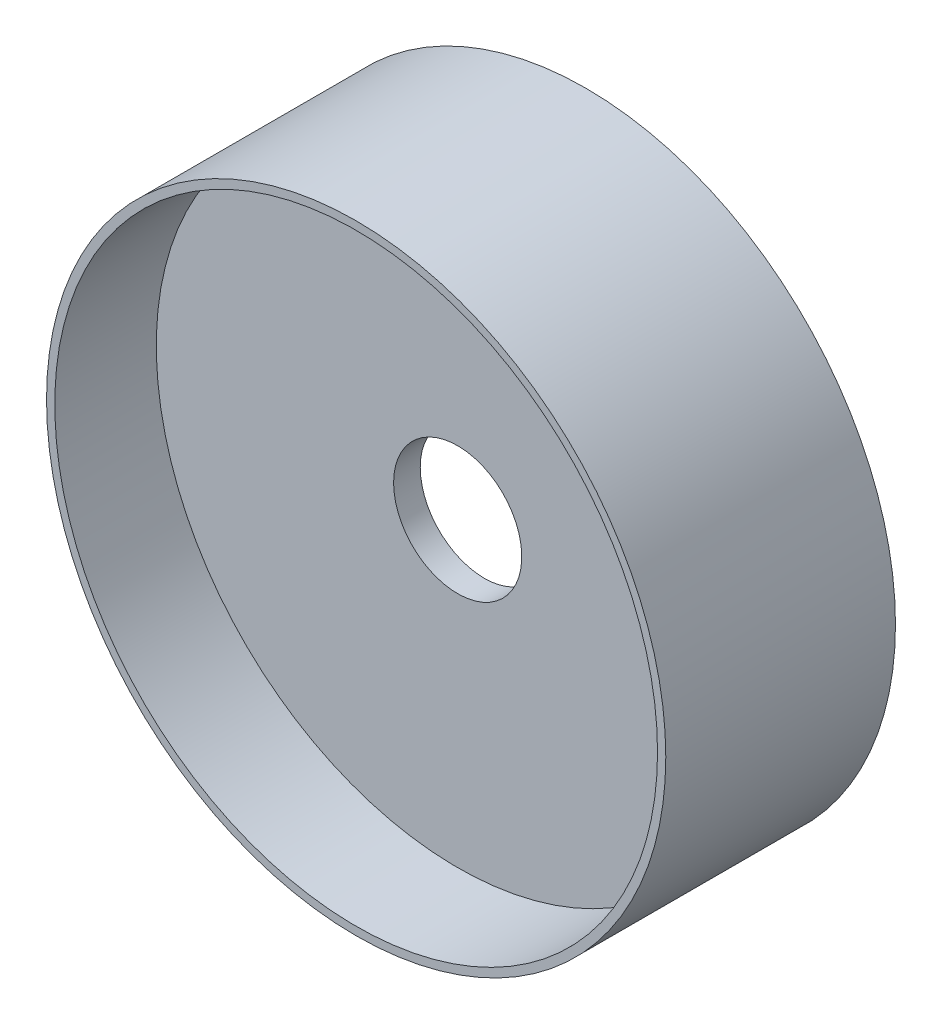
ISO-10303-21;
HEADER;
FILE_DESCRIPTION(('STEP AP214'),'2;1');
FILE_NAME('part.step','',(''),(''),'','','');
FILE_SCHEMA(('AUTOMOTIVE_DESIGN { 1 0 10303 214 1 1 1 1 }'));
ENDSEC;
DATA;
#1=APPLICATION_CONTEXT('core data for automotive mechanical design processes');
#2=APPLICATION_PROTOCOL_DEFINITION('international standard','automotive_design',2000,#1);
#3=PRODUCT_CONTEXT('',#1,'mechanical');
#4=PRODUCT('Part','Part','',(#3));
#5=PRODUCT_RELATED_PRODUCT_CATEGORY('part','',(#4));
#6=PRODUCT_DEFINITION_FORMATION('','',#4);
#7=PRODUCT_DEFINITION_CONTEXT('part definition',#1,'design');
#8=PRODUCT_DEFINITION('design','',#6,#7);
#9=PRODUCT_DEFINITION_SHAPE('','',#8);
#10=(LENGTH_UNIT() NAMED_UNIT(*) SI_UNIT(.MILLI.,.METRE.));
#11=(NAMED_UNIT(*) PLANE_ANGLE_UNIT() SI_UNIT($,.RADIAN.));
#12=(NAMED_UNIT(*) SI_UNIT($,.STERADIAN.) SOLID_ANGLE_UNIT());
#13=UNCERTAINTY_MEASURE_WITH_UNIT(LENGTH_MEASURE(1.E-05),#10,'distance_accuracy_value','');
#14=(GEOMETRIC_REPRESENTATION_CONTEXT(3) GLOBAL_UNCERTAINTY_ASSIGNED_CONTEXT((#13)) GLOBAL_UNIT_ASSIGNED_CONTEXT((#10,
#11,#12)) REPRESENTATION_CONTEXT('',''));
#15=CARTESIAN_POINT('',(0.,0.,0.));
#16=DIRECTION('',(0.,0.,1.));
#17=DIRECTION('',(1.,0.,0.));
#18=AXIS2_PLACEMENT_3D('',#15,#16,#17);
#19=CARTESIAN_POINT('',(0.,0.,45.974));
#20=DIRECTION('',(0.,0.,1.));
#21=DIRECTION('',(1.,0.,0.));
#22=AXIS2_PLACEMENT_3D('',#19,#20,#21);
#23=PLANE('',#22);
#24=CARTESIAN_POINT('',(0.,0.,45.974));
#25=DIRECTION('',(0.,0.,1.));
#26=DIRECTION('',(1.,0.,0.));
#27=AXIS2_PLACEMENT_3D('',#24,#25,#26);
#28=CIRCLE('',#27,60.325);
#29=CARTESIAN_POINT('',(60.325,0.,45.974));
#30=VERTEX_POINT('',#29);
#31=EDGE_CURVE('E73',#30,#30,#28,.T.);
#32=ORIENTED_EDGE('',*,*,#31,.F.);
#33=EDGE_LOOP('',(#32));
#34=FACE_BOUND('',#33,.T.);
#35=CARTESIAN_POINT('',(0.,0.,45.974));
#36=DIRECTION('',(0.,0.,1.));
#37=DIRECTION('',(1.,0.,0.));
#38=AXIS2_PLACEMENT_3D('',#35,#36,#37);
#39=CIRCLE('',#38,61.976);
#40=CARTESIAN_POINT('',(61.976,0.,45.974));
#41=VERTEX_POINT('',#40);
#42=EDGE_CURVE('E10',#41,#41,#39,.T.);
#43=ORIENTED_EDGE('',*,*,#42,.T.);
#44=EDGE_LOOP('',(#43));
#45=FACE_BOUND('',#44,.T.);
#46=ADVANCED_FACE('F41',(#34,#45),#23,.T.);
#47=CARTESIAN_POINT('',(0.,0.,0.));
#48=DIRECTION('',(0.,0.,1.));
#49=DIRECTION('',(1.,0.,0.));
#50=AXIS2_PLACEMENT_3D('',#47,#48,#49);
#51=PLANE('',#50);
#52=CARTESIAN_POINT('',(0.,0.,0.));
#53=DIRECTION('',(0.,0.,1.));
#54=DIRECTION('',(1.,0.,0.));
#55=AXIS2_PLACEMENT_3D('',#52,#53,#54);
#56=CIRCLE('',#55,60.325);
#57=CARTESIAN_POINT('',(60.325,0.,0.));
#58=VERTEX_POINT('',#57);
#59=EDGE_CURVE('E59',#58,#58,#56,.T.);
#60=ORIENTED_EDGE('',*,*,#59,.T.);
#61=EDGE_LOOP('',(#60));
#62=FACE_BOUND('',#61,.T.);
#63=CARTESIAN_POINT('',(0.,0.,0.));
#64=DIRECTION('',(0.,0.,1.));
#65=DIRECTION('',(1.,0.,0.));
#66=AXIS2_PLACEMENT_3D('',#63,#64,#65);
#67=CIRCLE('',#66,61.976);
#68=CARTESIAN_POINT('',(61.976,0.,0.));
#69=VERTEX_POINT('',#68);
#70=EDGE_CURVE('E50',#69,#69,#67,.T.);
#71=ORIENTED_EDGE('',*,*,#70,.F.);
#72=EDGE_LOOP('',(#71));
#73=FACE_BOUND('',#72,.T.);
#74=ADVANCED_FACE('F99',(#62,#73),#51,.F.);
#75=CARTESIAN_POINT('',(0.,0.,45.974));
#76=DIRECTION('',(0.,0.,-1.));
#77=DIRECTION('',(-1.,0.,0.));
#78=AXIS2_PLACEMENT_3D('',#75,#76,#77);
#79=CYLINDRICAL_SURFACE('',#78,61.976);
#80=ORIENTED_EDGE('',*,*,#42,.F.);
#81=EDGE_LOOP('',(#80));
#82=FACE_BOUND('',#81,.T.);
#83=ORIENTED_EDGE('',*,*,#70,.T.);
#84=EDGE_LOOP('',(#83));
#85=FACE_BOUND('',#84,.T.);
#86=ADVANCED_FACE('F43',(#82,#85),#79,.T.);
#87=CARTESIAN_POINT('',(0.,0.,45.974));
#88=DIRECTION('',(0.,0.,-1.));
#89=DIRECTION('',(-1.,0.,0.));
#90=AXIS2_PLACEMENT_3D('',#87,#88,#89);
#91=CYLINDRICAL_SURFACE('',#90,12.827);
#92=CARTESIAN_POINT('',(0.,0.,25.654));
#93=DIRECTION('',(0.,0.,-1.));
#94=DIRECTION('',(-1.,0.,0.));
#95=AXIS2_PLACEMENT_3D('',#92,#93,#94);
#96=CIRCLE('',#95,12.827);
#97=CARTESIAN_POINT('',(-12.827,0.,25.654));
#98=VERTEX_POINT('',#97);
#99=EDGE_CURVE('E45',#98,#98,#96,.T.);
#100=ORIENTED_EDGE('',*,*,#99,.F.);
#101=EDGE_LOOP('',(#100));
#102=FACE_BOUND('',#101,.T.);
#103=CARTESIAN_POINT('',(0.,0.,20.32));
#104=DIRECTION('',(0.,0.,1.));
#105=DIRECTION('',(1.,0.,0.));
#106=AXIS2_PLACEMENT_3D('',#103,#104,#105);
#107=CIRCLE('',#106,12.827);
#108=CARTESIAN_POINT('',(12.827,0.,20.32));
#109=VERTEX_POINT('',#108);
#110=EDGE_CURVE('E56',#109,#109,#107,.T.);
#111=ORIENTED_EDGE('',*,*,#110,.F.);
#112=EDGE_LOOP('',(#111));
#113=FACE_BOUND('',#112,.T.);
#114=ADVANCED_FACE('F88',(#102,#113),#91,.F.);
#115=CARTESIAN_POINT('',(0.,0.,20.32));
#116=DIRECTION('',(0.,0.,-1.));
#117=DIRECTION('',(-1.,0.,0.));
#118=AXIS2_PLACEMENT_3D('',#115,#116,#117);
#119=CYLINDRICAL_SURFACE('',#118,60.325);
#120=CARTESIAN_POINT('',(0.,0.,20.32));
#121=DIRECTION('',(0.,0.,1.));
#122=DIRECTION('',(1.,0.,0.));
#123=AXIS2_PLACEMENT_3D('',#120,#121,#122);
#124=CIRCLE('',#123,60.325);
#125=CARTESIAN_POINT('',(60.325,0.,20.32));
#126=VERTEX_POINT('',#125);
#127=EDGE_CURVE('E63',#126,#126,#124,.T.);
#128=ORIENTED_EDGE('',*,*,#127,.T.);
#129=EDGE_LOOP('',(#128));
#130=FACE_BOUND('',#129,.T.);
#131=ORIENTED_EDGE('',*,*,#59,.F.);
#132=EDGE_LOOP('',(#131));
#133=FACE_BOUND('',#132,.T.);
#134=ADVANCED_FACE('F91',(#130,#133),#119,.F.);
#135=CARTESIAN_POINT('',(0.,0.,20.32));
#136=DIRECTION('',(0.,0.,1.));
#137=DIRECTION('',(1.,0.,0.));
#138=AXIS2_PLACEMENT_3D('',#135,#136,#137);
#139=PLANE('',#138);
#140=ORIENTED_EDGE('',*,*,#110,.T.);
#141=EDGE_LOOP('',(#140));
#142=FACE_BOUND('',#141,.T.);
#143=ORIENTED_EDGE('',*,*,#127,.F.);
#144=EDGE_LOOP('',(#143));
#145=FACE_BOUND('',#144,.T.);
#146=ADVANCED_FACE('F97',(#142,#145),#139,.F.);
#147=CARTESIAN_POINT('',(0.,0.,25.654));
#148=DIRECTION('',(0.,0.,1.));
#149=DIRECTION('',(1.,0.,0.));
#150=AXIS2_PLACEMENT_3D('',#147,#148,#149);
#151=CYLINDRICAL_SURFACE('',#150,60.325);
#152=CARTESIAN_POINT('',(0.,0.,25.654));
#153=DIRECTION('',(0.,0.,1.));
#154=DIRECTION('',(1.,0.,0.));
#155=AXIS2_PLACEMENT_3D('',#152,#153,#154);
#156=CIRCLE('',#155,60.325);
#157=CARTESIAN_POINT('',(60.325,0.,25.654));
#158=VERTEX_POINT('',#157);
#159=EDGE_CURVE('E77',#158,#158,#156,.T.);
#160=ORIENTED_EDGE('',*,*,#159,.F.);
#161=EDGE_LOOP('',(#160));
#162=FACE_BOUND('',#161,.T.);
#163=ORIENTED_EDGE('',*,*,#31,.T.);
#164=EDGE_LOOP('',(#163));
#165=FACE_BOUND('',#164,.T.);
#166=ADVANCED_FACE('F110',(#162,#165),#151,.F.);
#167=CARTESIAN_POINT('',(0.,0.,25.654));
#168=DIRECTION('',(0.,0.,-1.));
#169=DIRECTION('',(1.,0.,0.));
#170=AXIS2_PLACEMENT_3D('',#167,#168,#169);
#171=PLANE('',#170);
#172=ORIENTED_EDGE('',*,*,#99,.T.);
#173=EDGE_LOOP('',(#172));
#174=FACE_BOUND('',#173,.T.);
#175=ORIENTED_EDGE('',*,*,#159,.T.);
#176=EDGE_LOOP('',(#175));
#177=FACE_BOUND('',#176,.T.);
#178=ADVANCED_FACE('F86',(#174,#177),#171,.F.);
#179=CLOSED_SHELL('',(#46,#74,#86,#114,#134,#146,#166,#178));
#180=MANIFOLD_SOLID_BREP('B2',#179);
#181=ADVANCED_BREP_SHAPE_REPRESENTATION('',(#18,#180),#14);
#182=SHAPE_DEFINITION_REPRESENTATION(#9,#181);
ENDSEC;
END-ISO-10303-21;
